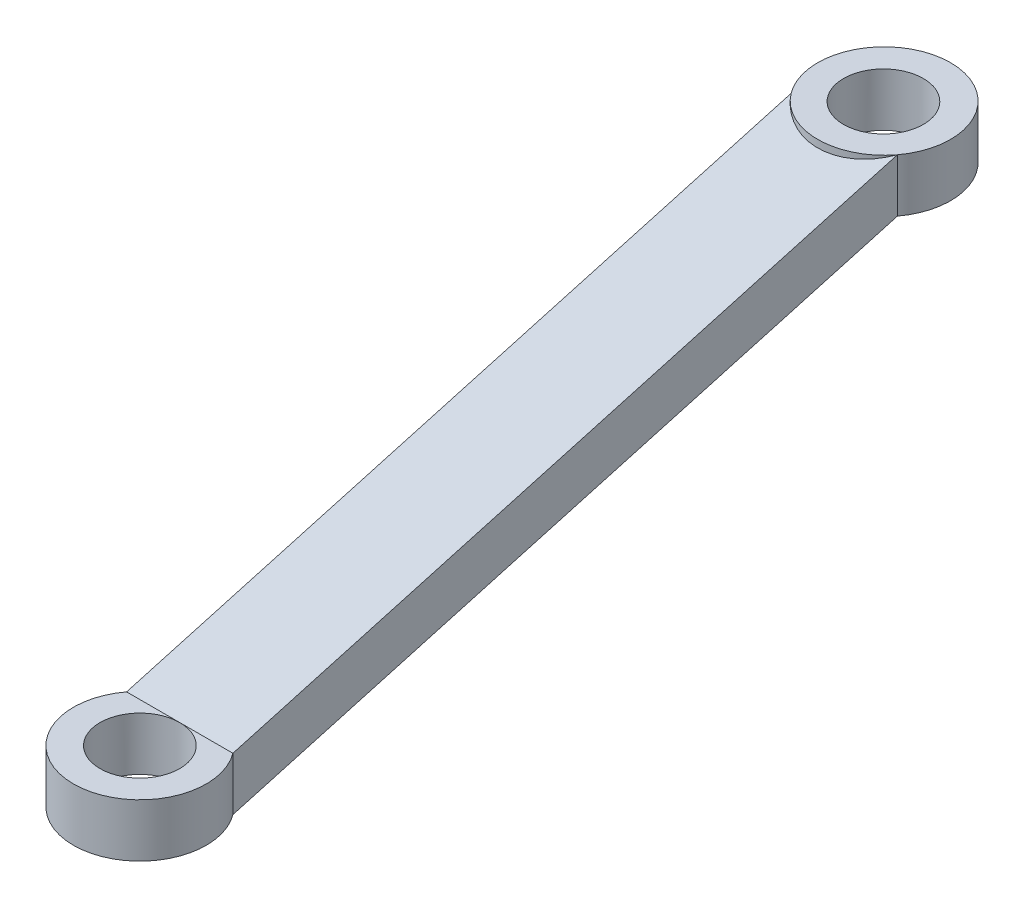
ISO-10303-21;
HEADER;
FILE_DESCRIPTION(('STEP AP214'),'2;1');
FILE_NAME('part.step','',(''),(''),'','','');
FILE_SCHEMA(('AUTOMOTIVE_DESIGN { 1 0 10303 214 1 1 1 1 }'));
ENDSEC;
DATA;
#1=APPLICATION_CONTEXT('core data for automotive mechanical design processes');
#2=APPLICATION_PROTOCOL_DEFINITION('international standard','automotive_design',2000,#1);
#3=PRODUCT_CONTEXT('',#1,'mechanical');
#4=PRODUCT('Part','Part','',(#3));
#5=PRODUCT_RELATED_PRODUCT_CATEGORY('part','',(#4));
#6=PRODUCT_DEFINITION_FORMATION('','',#4);
#7=PRODUCT_DEFINITION_CONTEXT('part definition',#1,'design');
#8=PRODUCT_DEFINITION('design','',#6,#7);
#9=PRODUCT_DEFINITION_SHAPE('','',#8);
#10=(LENGTH_UNIT() NAMED_UNIT(*) SI_UNIT(.MILLI.,.METRE.));
#11=(NAMED_UNIT(*) PLANE_ANGLE_UNIT() SI_UNIT($,.RADIAN.));
#12=(NAMED_UNIT(*) SI_UNIT($,.STERADIAN.) SOLID_ANGLE_UNIT());
#13=UNCERTAINTY_MEASURE_WITH_UNIT(LENGTH_MEASURE(1.E-05),#10,'distance_accuracy_value','');
#14=(GEOMETRIC_REPRESENTATION_CONTEXT(3) GLOBAL_UNCERTAINTY_ASSIGNED_CONTEXT((#13)) GLOBAL_UNIT_ASSIGNED_CONTEXT((#10,
#11,#12)) REPRESENTATION_CONTEXT('',''));
#15=CARTESIAN_POINT('',(0.,0.,0.));
#16=DIRECTION('',(0.,0.,1.));
#17=DIRECTION('',(1.,0.,0.));
#18=AXIS2_PLACEMENT_3D('',#15,#16,#17);
#19=CARTESIAN_POINT('',(4.,7.,-25.));
#20=DIRECTION('',(0.,0.962964019714182,0.269629925519971));
#21=DIRECTION('',(0.,-0.269629925519971,0.962964019714182));
#22=AXIS2_PLACEMENT_3D('',#19,#20,#21);
#23=PLANE('',#22);
#24=DIRECTION('',(-1.,0.,0.));
#25=VECTOR('',#24,1.);
#26=CARTESIAN_POINT('',(4.,7.,-25.));
#27=LINE('',#26,#25);
#28=CARTESIAN_POINT('',(1.71999241460582,7.,-25.));
#29=VERTEX_POINT('',#28);
#30=CARTESIAN_POINT('',(0.,7.,-25.));
#31=VERTEX_POINT('',#30);
#32=EDGE_CURVE('E85',#29,#31,#27,.T.);
#33=ORIENTED_EDGE('',*,*,#32,.F.);
#34=CARTESIAN_POINT('',(2.00152802572557,7.41253585984037,-26.4733423565728));
#35=DIRECTION('',(0.,0.962964019714182,0.269629925519971));
#36=DIRECTION('',(0.,0.269629925519971,-0.962964019714182));
#37=AXIS2_PLACEMENT_3D('',#34,#35,#36);
#38=ELLIPSE('',#37,1.55769059828966,1.5);
#39=CARTESIAN_POINT('',(2.28306363684531,7.,-25.));
#40=VERTEX_POINT('',#39);
#41=EDGE_CURVE('E44',#29,#40,#38,.T.);
#42=ORIENTED_EDGE('',*,*,#41,.T.);
#43=CARTESIAN_POINT('',(4.,7.,-25.));
#44=VERTEX_POINT('',#43);
#45=EDGE_CURVE('E39',#44,#40,#27,.T.);
#46=ORIENTED_EDGE('',*,*,#45,.F.);
#47=DIRECTION('',(0.,0.269629925519971,-0.962964019714182));
#48=VECTOR('',#47,1.);
#49=CARTESIAN_POINT('',(4.,7.,-25.));
#50=LINE('',#49,#48);
#51=CARTESIAN_POINT('',(4.,0.,0.));
#52=VERTEX_POINT('',#51);
#53=EDGE_CURVE('E100',#52,#44,#50,.T.);
#54=ORIENTED_EDGE('',*,*,#53,.F.);
#55=CARTESIAN_POINT('',(2.,-0.42,1.5));
#56=DIRECTION('',(0.,0.962964019714182,0.269629925519971));
#57=DIRECTION('',(0.,-0.269629925519971,0.962964019714182));
#58=AXIS2_PLACEMENT_3D('',#55,#56,#57);
#59=ELLIPSE('',#58,2.59615099714943,2.5);
#60=CARTESIAN_POINT('',(0.,0.,0.));
#61=VERTEX_POINT('',#60);
#62=EDGE_CURVE('E109',#61,#52,#59,.F.);
#63=ORIENTED_EDGE('',*,*,#62,.F.);
#64=DIRECTION('',(0.,0.269629925519971,-0.962964019714182));
#65=VECTOR('',#64,1.);
#66=CARTESIAN_POINT('',(0.,7.,-25.));
#67=LINE('',#66,#65);
#68=EDGE_CURVE('E107',#61,#31,#67,.T.);
#69=ORIENTED_EDGE('',*,*,#68,.T.);
#70=EDGE_LOOP('',(#33,#42,#46,#54,#63,#69));
#71=FACE_BOUND('',#70,.T.);
#72=ADVANCED_FACE('F32',(#71),#23,.F.);
#73=CARTESIAN_POINT('',(4.,2.,0.));
#74=DIRECTION('',(0.,-0.962964019714182,-0.269629925519971));
#75=DIRECTION('',(0.,0.269629925519971,-0.962964019714182));
#76=AXIS2_PLACEMENT_3D('',#73,#74,#75);
#77=PLANE('',#76);
#78=DIRECTION('',(0.,-0.269629925519971,0.962964019714182));
#79=VECTOR('',#78,1.);
#80=CARTESIAN_POINT('',(4.,2.,0.));
#81=LINE('',#80,#79);
#82=CARTESIAN_POINT('',(4.,8.99999999999999,-25.));
#83=VERTEX_POINT('',#82);
#84=CARTESIAN_POINT('',(4.,2.,0.));
#85=VERTEX_POINT('',#84);
#86=EDGE_CURVE('E112',#83,#85,#81,.T.);
#87=ORIENTED_EDGE('',*,*,#86,.F.);
#88=CARTESIAN_POINT('',(2.,9.42,-26.5));
#89=DIRECTION('',(0.,-0.962964019714182,-0.269629925519971));
#90=DIRECTION('',(0.,-0.269629925519971,0.962964019714182));
#91=AXIS2_PLACEMENT_3D('',#88,#89,#90);
#92=ELLIPSE('',#91,2.59615099714943,2.5);
#93=CARTESIAN_POINT('',(0.,8.99999999999999,-25.));
#94=VERTEX_POINT('',#93);
#95=EDGE_CURVE('E126',#83,#94,#92,.T.);
#96=ORIENTED_EDGE('',*,*,#95,.T.);
#97=DIRECTION('',(0.,-0.269629925519971,0.962964019714182));
#98=VECTOR('',#97,1.);
#99=CARTESIAN_POINT('',(0.,2.,0.));
#100=LINE('',#99,#98);
#101=CARTESIAN_POINT('',(0.,2.,0.));
#102=VERTEX_POINT('',#101);
#103=EDGE_CURVE('E101',#94,#102,#100,.T.);
#104=ORIENTED_EDGE('',*,*,#103,.T.);
#105=DIRECTION('',(-1.,0.,0.));
#106=VECTOR('',#105,1.);
#107=CARTESIAN_POINT('',(4.,2.,0.));
#108=LINE('',#107,#106);
#109=CARTESIAN_POINT('',(2.,2.,0.));
#110=VERTEX_POINT('',#109);
#111=EDGE_CURVE('E96',#110,#102,#108,.T.);
#112=ORIENTED_EDGE('',*,*,#111,.F.);
#113=EDGE_CURVE('E92',#85,#110,#108,.T.);
#114=ORIENTED_EDGE('',*,*,#113,.F.);
#115=EDGE_LOOP('',(#87,#96,#104,#112,#114));
#116=FACE_BOUND('',#115,.T.);
#117=ADVANCED_FACE('F184',(#116),#77,.F.);
#118=CARTESIAN_POINT('',(4.,0.,0.));
#119=DIRECTION('',(-1.,0.,0.));
#120=DIRECTION('',(0.,0.,1.));
#121=AXIS2_PLACEMENT_3D('',#118,#119,#120);
#122=PLANE('',#121);
#123=ORIENTED_EDGE('',*,*,#53,.T.);
#124=DIRECTION('',(0.,1.,0.));
#125=VECTOR('',#124,1.);
#126=CARTESIAN_POINT('',(4.,8.99999999999999,-25.));
#127=LINE('',#126,#125);
#128=EDGE_CURVE('E114',#44,#83,#127,.T.);
#129=ORIENTED_EDGE('',*,*,#128,.T.);
#130=ORIENTED_EDGE('',*,*,#86,.T.);
#131=DIRECTION('',(0.,-1.,0.));
#132=VECTOR('',#131,1.);
#133=CARTESIAN_POINT('',(4.,0.,0.));
#134=LINE('',#133,#132);
#135=EDGE_CURVE('E110',#85,#52,#134,.T.);
#136=ORIENTED_EDGE('',*,*,#135,.T.);
#137=EDGE_LOOP('',(#123,#129,#130,#136));
#138=FACE_BOUND('',#137,.T.);
#139=ADVANCED_FACE('F188',(#138),#122,.F.);
#140=CARTESIAN_POINT('',(0.,0.,0.));
#141=DIRECTION('',(-1.,0.,0.));
#142=DIRECTION('',(0.,0.,1.));
#143=AXIS2_PLACEMENT_3D('',#140,#141,#142);
#144=PLANE('',#143);
#145=ORIENTED_EDGE('',*,*,#68,.F.);
#146=DIRECTION('',(0.,-1.,0.));
#147=VECTOR('',#146,1.);
#148=CARTESIAN_POINT('',(0.,0.,0.));
#149=LINE('',#148,#147);
#150=EDGE_CURVE('E97',#102,#61,#149,.T.);
#151=ORIENTED_EDGE('',*,*,#150,.F.);
#152=ORIENTED_EDGE('',*,*,#103,.F.);
#153=DIRECTION('',(0.,1.,0.));
#154=VECTOR('',#153,1.);
#155=CARTESIAN_POINT('',(0.,8.99999999999999,-25.));
#156=LINE('',#155,#154);
#157=EDGE_CURVE('E104',#31,#94,#156,.T.);
#158=ORIENTED_EDGE('',*,*,#157,.F.);
#159=EDGE_LOOP('',(#145,#151,#152,#158));
#160=FACE_BOUND('',#159,.T.);
#161=ADVANCED_FACE('F158',(#160),#144,.T.);
#162=CARTESIAN_POINT('',(2.,2.,1.5));
#163=DIRECTION('',(0.,-1.,0.));
#164=DIRECTION('',(0.,0.,-1.));
#165=AXIS2_PLACEMENT_3D('',#162,#163,#164);
#166=CYLINDRICAL_SURFACE('',#165,2.5);
#167=CARTESIAN_POINT('',(2.,0.,1.5));
#168=DIRECTION('',(0.,1.,0.));
#169=DIRECTION('',(0.,0.,1.));
#170=AXIS2_PLACEMENT_3D('',#167,#168,#169);
#171=CIRCLE('',#170,2.5);
#172=EDGE_CURVE('E123',#61,#52,#171,.T.);
#173=ORIENTED_EDGE('',*,*,#172,.T.);
#174=ORIENTED_EDGE('',*,*,#135,.F.);
#175=CARTESIAN_POINT('',(2.,2.,1.5));
#176=DIRECTION('',(0.,1.,0.));
#177=DIRECTION('',(0.,0.,1.));
#178=AXIS2_PLACEMENT_3D('',#175,#176,#177);
#179=CIRCLE('',#178,2.5);
#180=EDGE_CURVE('E119',#102,#85,#179,.T.);
#181=ORIENTED_EDGE('',*,*,#180,.F.);
#182=ORIENTED_EDGE('',*,*,#150,.T.);
#183=EDGE_LOOP('',(#173,#174,#181,#182));
#184=FACE_BOUND('',#183,.T.);
#185=ADVANCED_FACE('F166',(#184),#166,.T.);
#186=EDGE_CURVE('E120',#52,#61,#171,.T.);
#187=ORIENTED_EDGE('',*,*,#186,.T.);
#188=ORIENTED_EDGE('',*,*,#62,.T.);
#189=EDGE_LOOP('',(#187,#188));
#190=FACE_BOUND('',#189,.T.);
#191=ADVANCED_FACE('F171',(#190),#166,.T.);
#192=CARTESIAN_POINT('',(2.,2.,1.5));
#193=DIRECTION('',(0.,1.,0.));
#194=DIRECTION('',(0.,0.,1.));
#195=AXIS2_PLACEMENT_3D('',#192,#193,#194);
#196=PLANE('',#195);
#197=ORIENTED_EDGE('',*,*,#113,.T.);
#198=CARTESIAN_POINT('',(2.,2.,1.5));
#199=DIRECTION('',(0.,1.,0.));
#200=DIRECTION('',(0.,0.,1.));
#201=AXIS2_PLACEMENT_3D('',#198,#199,#200);
#202=CIRCLE('',#201,1.5);
#203=EDGE_CURVE('E50',#110,#110,#202,.T.);
#204=ORIENTED_EDGE('',*,*,#203,.F.);
#205=ORIENTED_EDGE('',*,*,#111,.T.);
#206=ORIENTED_EDGE('',*,*,#180,.T.);
#207=EDGE_LOOP('',(#197,#204,#205,#206));
#208=FACE_BOUND('',#207,.T.);
#209=ADVANCED_FACE('F173',(#208),#196,.T.);
#210=CARTESIAN_POINT('',(2.,0.,1.5));
#211=DIRECTION('',(0.,1.,0.));
#212=DIRECTION('',(0.,0.,1.));
#213=AXIS2_PLACEMENT_3D('',#210,#211,#212);
#214=PLANE('',#213);
#215=CARTESIAN_POINT('',(2.,0.,1.5));
#216=DIRECTION('',(0.,1.,0.));
#217=DIRECTION('',(0.,0.,1.));
#218=AXIS2_PLACEMENT_3D('',#215,#216,#217);
#219=CIRCLE('',#218,1.5);
#220=CARTESIAN_POINT('',(2.,0.,3.));
#221=VERTEX_POINT('',#220);
#222=EDGE_CURVE('E132',#221,#221,#219,.T.);
#223=ORIENTED_EDGE('',*,*,#222,.T.);
#224=EDGE_LOOP('',(#223));
#225=FACE_BOUND('',#224,.T.);
#226=ORIENTED_EDGE('',*,*,#172,.F.);
#227=ORIENTED_EDGE('',*,*,#186,.F.);
#228=EDGE_LOOP('',(#226,#227));
#229=FACE_BOUND('',#228,.T.);
#230=ADVANCED_FACE('F170',(#225,#229),#214,.F.);
#231=CARTESIAN_POINT('',(2.,9.,-26.5));
#232=DIRECTION('',(0.,-1.,0.));
#233=DIRECTION('',(0.,0.,-1.));
#234=AXIS2_PLACEMENT_3D('',#231,#232,#233);
#235=CYLINDRICAL_SURFACE('',#234,2.5);
#236=ORIENTED_EDGE('',*,*,#128,.F.);
#237=CARTESIAN_POINT('',(2.,7.,-26.5));
#238=DIRECTION('',(0.,-1.,0.));
#239=DIRECTION('',(0.,0.,-1.));
#240=AXIS2_PLACEMENT_3D('',#237,#238,#239);
#241=CIRCLE('',#240,2.5);
#242=EDGE_CURVE('E91',#31,#44,#241,.T.);
#243=ORIENTED_EDGE('',*,*,#242,.F.);
#244=ORIENTED_EDGE('',*,*,#157,.T.);
#245=CARTESIAN_POINT('',(2.,9.,-26.5));
#246=DIRECTION('',(0.,-1.,0.));
#247=DIRECTION('',(0.,0.,-1.));
#248=AXIS2_PLACEMENT_3D('',#245,#246,#247);
#249=CIRCLE('',#248,2.5);
#250=EDGE_CURVE('E131',#94,#83,#249,.T.);
#251=ORIENTED_EDGE('',*,*,#250,.T.);
#252=EDGE_LOOP('',(#236,#243,#244,#251));
#253=FACE_BOUND('',#252,.T.);
#254=ADVANCED_FACE('F155',(#253),#235,.T.);
#255=ORIENTED_EDGE('',*,*,#95,.F.);
#256=EDGE_CURVE('E129',#83,#94,#249,.T.);
#257=ORIENTED_EDGE('',*,*,#256,.T.);
#258=EDGE_LOOP('',(#255,#257));
#259=FACE_BOUND('',#258,.T.);
#260=ADVANCED_FACE('F145',(#259),#235,.T.);
#261=CARTESIAN_POINT('',(2.,9.,-26.5));
#262=DIRECTION('',(0.,-1.,0.));
#263=DIRECTION('',(0.,0.,-1.));
#264=AXIS2_PLACEMENT_3D('',#261,#262,#263);
#265=PLANE('',#264);
#266=CARTESIAN_POINT('',(2.00152802572557,9.,-26.4733423565728));
#267=DIRECTION('',(0.,1.,0.));
#268=DIRECTION('',(0.,0.,1.));
#269=AXIS2_PLACEMENT_3D('',#266,#267,#268);
#270=CIRCLE('',#269,1.5);
#271=CARTESIAN_POINT('',(2.00152802572557,8.99999999999999,-24.9733423565728));
#272=VERTEX_POINT('',#271);
#273=EDGE_CURVE('E86',#272,#272,#270,.T.);
#274=ORIENTED_EDGE('',*,*,#273,.F.);
#275=EDGE_LOOP('',(#274));
#276=FACE_BOUND('',#275,.T.);
#277=ORIENTED_EDGE('',*,*,#256,.F.);
#278=ORIENTED_EDGE('',*,*,#250,.F.);
#279=EDGE_LOOP('',(#277,#278));
#280=FACE_BOUND('',#279,.T.);
#281=ADVANCED_FACE('F142',(#276,#280),#265,.F.);
#282=CARTESIAN_POINT('',(2.,7.,-26.5));
#283=DIRECTION('',(0.,-1.,0.));
#284=DIRECTION('',(0.,0.,-1.));
#285=AXIS2_PLACEMENT_3D('',#282,#283,#284);
#286=PLANE('',#285);
#287=CARTESIAN_POINT('',(2.00152802572557,7.,-26.4733423565728));
#288=DIRECTION('',(0.,-1.,0.));
#289=DIRECTION('',(0.,0.,-1.));
#290=AXIS2_PLACEMENT_3D('',#287,#288,#289);
#291=CIRCLE('',#290,1.5);
#292=EDGE_CURVE('E11',#29,#40,#291,.T.);
#293=ORIENTED_EDGE('',*,*,#292,.F.);
#294=ORIENTED_EDGE('',*,*,#32,.T.);
#295=ORIENTED_EDGE('',*,*,#242,.T.);
#296=ORIENTED_EDGE('',*,*,#45,.T.);
#297=EDGE_LOOP('',(#293,#294,#295,#296));
#298=FACE_BOUND('',#297,.T.);
#299=ADVANCED_FACE('F89',(#298),#286,.T.);
#300=CARTESIAN_POINT('',(2.,0.,1.5));
#301=DIRECTION('',(0.,1.,0.));
#302=DIRECTION('',(0.,0.,1.));
#303=AXIS2_PLACEMENT_3D('',#300,#301,#302);
#304=CYLINDRICAL_SURFACE('',#303,1.5);
#305=ORIENTED_EDGE('',*,*,#222,.F.);
#306=EDGE_LOOP('',(#305));
#307=FACE_BOUND('',#306,.T.);
#308=ORIENTED_EDGE('',*,*,#203,.T.);
#309=EDGE_LOOP('',(#308));
#310=FACE_BOUND('',#309,.T.);
#311=ADVANCED_FACE('F228',(#307,#310),#304,.F.);
#312=CARTESIAN_POINT('',(2.00152802572557,0.,-26.4733423565728));
#313=DIRECTION('',(0.,1.,0.));
#314=DIRECTION('',(0.,0.,1.));
#315=AXIS2_PLACEMENT_3D('',#312,#313,#314);
#316=CYLINDRICAL_SURFACE('',#315,1.5);
#317=ORIENTED_EDGE('',*,*,#273,.T.);
#318=EDGE_LOOP('',(#317));
#319=FACE_BOUND('',#318,.T.);
#320=ORIENTED_EDGE('',*,*,#292,.T.);
#321=ORIENTED_EDGE('',*,*,#41,.F.);
#322=EDGE_LOOP('',(#320,#321));
#323=FACE_BOUND('',#322,.T.);
#324=ADVANCED_FACE('F76',(#319,#323),#316,.F.);
#325=CLOSED_SHELL('',(#72,#117,#139,#161,#185,#191,#209,#230,#254,#260,#281,#299,#311,#324));
#326=MANIFOLD_SOLID_BREP('B2',#325);
#327=ADVANCED_BREP_SHAPE_REPRESENTATION('',(#18,#326),#14);
#328=SHAPE_DEFINITION_REPRESENTATION(#9,#327);
ENDSEC;
END-ISO-10303-21;
